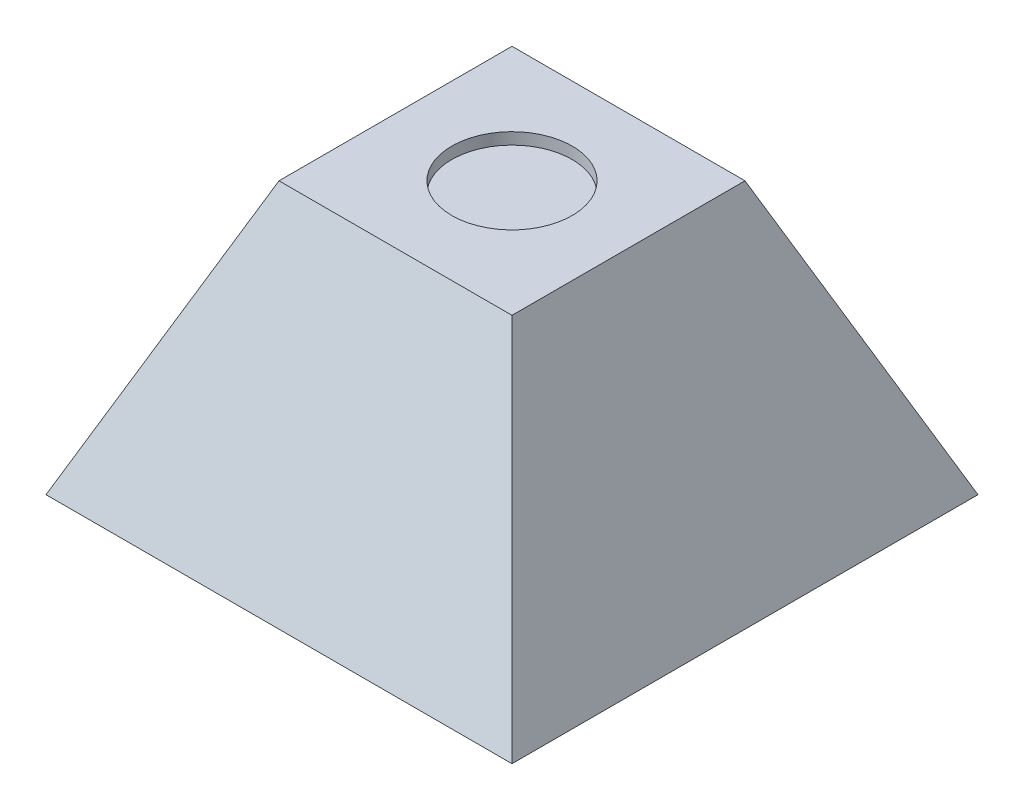
ISO-10303-21;
HEADER;
FILE_DESCRIPTION(('STEP AP214'),'2;1');
FILE_NAME('part.step','',(''),(''),'','','');
FILE_SCHEMA(('AUTOMOTIVE_DESIGN { 1 0 10303 214 1 1 1 1 }'));
ENDSEC;
DATA;
#1=APPLICATION_CONTEXT('core data for automotive mechanical design processes');
#2=APPLICATION_PROTOCOL_DEFINITION('international standard','automotive_design',2000,#1);
#3=PRODUCT_CONTEXT('',#1,'mechanical');
#4=PRODUCT('Part','Part','',(#3));
#5=PRODUCT_RELATED_PRODUCT_CATEGORY('part','',(#4));
#6=PRODUCT_DEFINITION_FORMATION('','',#4);
#7=PRODUCT_DEFINITION_CONTEXT('part definition',#1,'design');
#8=PRODUCT_DEFINITION('design','',#6,#7);
#9=PRODUCT_DEFINITION_SHAPE('','',#8);
#10=(LENGTH_UNIT() NAMED_UNIT(*) SI_UNIT(.MILLI.,.METRE.));
#11=(NAMED_UNIT(*) PLANE_ANGLE_UNIT() SI_UNIT($,.RADIAN.));
#12=(NAMED_UNIT(*) SI_UNIT($,.STERADIAN.) SOLID_ANGLE_UNIT());
#13=UNCERTAINTY_MEASURE_WITH_UNIT(LENGTH_MEASURE(1.E-05),#10,'distance_accuracy_value','');
#14=(GEOMETRIC_REPRESENTATION_CONTEXT(3) GLOBAL_UNCERTAINTY_ASSIGNED_CONTEXT((#13)) GLOBAL_UNIT_ASSIGNED_CONTEXT((#10,
#11,#12)) REPRESENTATION_CONTEXT('',''));
#15=CARTESIAN_POINT('',(0.,0.,0.));
#16=DIRECTION('',(0.,0.,1.));
#17=DIRECTION('',(1.,0.,0.));
#18=AXIS2_PLACEMENT_3D('',#15,#16,#17);
#19=CARTESIAN_POINT('',(0.,0.,0.));
#20=DIRECTION('',(0.,-1.,0.));
#21=DIRECTION('',(0.,0.,-1.));
#22=AXIS2_PLACEMENT_3D('',#19,#20,#21);
#23=PLANE('',#22);
#24=DIRECTION('',(0.,0.,-1.));
#25=VECTOR('',#24,1.);
#26=CARTESIAN_POINT('',(60.,0.,60.));
#27=LINE('',#26,#25);
#28=CARTESIAN_POINT('',(60.,0.,60.));
#29=VERTEX_POINT('',#28);
#30=CARTESIAN_POINT('',(60.,0.,-60.));
#31=VERTEX_POINT('',#30);
#32=EDGE_CURVE('E179',#29,#31,#27,.T.);
#33=ORIENTED_EDGE('',*,*,#32,.F.);
#34=DIRECTION('',(1.,0.,0.));
#35=VECTOR('',#34,1.);
#36=CARTESIAN_POINT('',(-60.,0.,60.));
#37=LINE('',#36,#35);
#38=CARTESIAN_POINT('',(-60.,0.,60.));
#39=VERTEX_POINT('',#38);
#40=EDGE_CURVE('E12',#39,#29,#37,.T.);
#41=ORIENTED_EDGE('',*,*,#40,.F.);
#42=DIRECTION('',(0.,0.,1.));
#43=VECTOR('',#42,1.);
#44=CARTESIAN_POINT('',(-60.,0.,60.));
#45=LINE('',#44,#43);
#46=CARTESIAN_POINT('',(-60.,0.,-60.));
#47=VERTEX_POINT('',#46);
#48=EDGE_CURVE('E65',#47,#39,#45,.T.);
#49=ORIENTED_EDGE('',*,*,#48,.F.);
#50=DIRECTION('',(-1.,0.,0.));
#51=VECTOR('',#50,1.);
#52=CARTESIAN_POINT('',(-60.,0.,-60.));
#53=LINE('',#52,#51);
#54=EDGE_CURVE('E199',#31,#47,#53,.T.);
#55=ORIENTED_EDGE('',*,*,#54,.F.);
#56=EDGE_LOOP('',(#33,#41,#49,#55));
#57=FACE_BOUND('',#56,.T.);
#58=ADVANCED_FACE('F55',(#57),#23,.T.);
#59=CARTESIAN_POINT('',(0.,70.,0.));
#60=DIRECTION('',(0.,-1.,0.));
#61=DIRECTION('',(0.,0.,-1.));
#62=AXIS2_PLACEMENT_3D('',#59,#60,#61);
#63=PLANE('',#62);
#64=CARTESIAN_POINT('',(0.,70.,0.));
#65=DIRECTION('',(0.,1.,0.));
#66=DIRECTION('',(0.,0.,1.));
#67=AXIS2_PLACEMENT_3D('',#64,#65,#66);
#68=CIRCLE('',#67,15.5);
#69=CARTESIAN_POINT('',(0.,70.,15.5));
#70=VERTEX_POINT('',#69);
#71=EDGE_CURVE('E290',#70,#70,#68,.T.);
#72=ORIENTED_EDGE('',*,*,#71,.F.);
#73=EDGE_LOOP('',(#72));
#74=FACE_BOUND('',#73,.T.);
#75=DIRECTION('',(0.,0.,-1.));
#76=VECTOR('',#75,1.);
#77=CARTESIAN_POINT('',(30.,70.,30.));
#78=LINE('',#77,#76);
#79=CARTESIAN_POINT('',(30.,70.,30.));
#80=VERTEX_POINT('',#79);
#81=CARTESIAN_POINT('',(30.,70.,-30.));
#82=VERTEX_POINT('',#81);
#83=EDGE_CURVE('E167',#80,#82,#78,.T.);
#84=ORIENTED_EDGE('',*,*,#83,.T.);
#85=DIRECTION('',(-1.,0.,0.));
#86=VECTOR('',#85,1.);
#87=CARTESIAN_POINT('',(-30.,70.,-30.));
#88=LINE('',#87,#86);
#89=CARTESIAN_POINT('',(-30.,70.,-30.));
#90=VERTEX_POINT('',#89);
#91=EDGE_CURVE('E124',#82,#90,#88,.T.);
#92=ORIENTED_EDGE('',*,*,#91,.T.);
#93=DIRECTION('',(0.,0.,1.));
#94=VECTOR('',#93,1.);
#95=CARTESIAN_POINT('',(-30.,70.,30.));
#96=LINE('',#95,#94);
#97=CARTESIAN_POINT('',(-30.,70.,30.));
#98=VERTEX_POINT('',#97);
#99=EDGE_CURVE('E104',#90,#98,#96,.T.);
#100=ORIENTED_EDGE('',*,*,#99,.T.);
#101=DIRECTION('',(1.,0.,0.));
#102=VECTOR('',#101,1.);
#103=CARTESIAN_POINT('',(-30.,70.,30.));
#104=LINE('',#103,#102);
#105=EDGE_CURVE('E112',#98,#80,#104,.T.);
#106=ORIENTED_EDGE('',*,*,#105,.T.);
#107=EDGE_LOOP('',(#84,#92,#100,#106));
#108=FACE_BOUND('',#107,.T.);
#109=ADVANCED_FACE('F123',(#74,#108),#63,.F.);
#110=CARTESIAN_POINT('',(-50.6896551724138,21.7241379310345,0.));
#111=DIRECTION('',(-0.919145030018058,0.393919298579168,0.));
#112=DIRECTION('',(-0.393919298579168,-0.919145030018058,0.));
#113=AXIS2_PLACEMENT_3D('',#110,#111,#112);
#114=PLANE('',#113);
#115=DIRECTION('',(-0.366508333068916,-0.855186110494137,-0.366508333068916));
#116=VECTOR('',#115,1.);
#117=CARTESIAN_POINT('',(-30.,70.,-30.));
#118=LINE('',#117,#116);
#119=EDGE_CURVE('E110',#90,#47,#118,.T.);
#120=ORIENTED_EDGE('',*,*,#119,.T.);
#121=ORIENTED_EDGE('',*,*,#48,.T.);
#122=DIRECTION('',(-0.366508333068916,-0.855186110494137,0.366508333068916));
#123=VECTOR('',#122,1.);
#124=CARTESIAN_POINT('',(-30.,70.,30.));
#125=LINE('',#124,#123);
#126=EDGE_CURVE('E99',#98,#39,#125,.T.);
#127=ORIENTED_EDGE('',*,*,#126,.F.);
#128=ORIENTED_EDGE('',*,*,#99,.F.);
#129=EDGE_LOOP('',(#120,#121,#127,#128));
#130=FACE_BOUND('',#129,.T.);
#131=ADVANCED_FACE('F102',(#130),#114,.T.);
#132=CARTESIAN_POINT('',(0.,21.7241379310345,50.6896551724138));
#133=DIRECTION('',(0.,0.393919298579168,0.919145030018058));
#134=DIRECTION('',(0.,-0.919145030018058,0.393919298579168));
#135=AXIS2_PLACEMENT_3D('',#132,#133,#134);
#136=PLANE('',#135);
#137=ORIENTED_EDGE('',*,*,#126,.T.);
#138=ORIENTED_EDGE('',*,*,#40,.T.);
#139=DIRECTION('',(0.366508333068916,-0.855186110494137,0.366508333068916));
#140=VECTOR('',#139,1.);
#141=CARTESIAN_POINT('',(30.,70.,30.));
#142=LINE('',#141,#140);
#143=EDGE_CURVE('E73',#80,#29,#142,.T.);
#144=ORIENTED_EDGE('',*,*,#143,.F.);
#145=ORIENTED_EDGE('',*,*,#105,.F.);
#146=EDGE_LOOP('',(#137,#138,#144,#145));
#147=FACE_BOUND('',#146,.T.);
#148=ADVANCED_FACE('F114',(#147),#136,.T.);
#149=CARTESIAN_POINT('',(0.,21.7241379310345,-50.6896551724138));
#150=DIRECTION('',(0.,0.393919298579168,-0.919145030018058));
#151=DIRECTION('',(0.,0.919145030018058,0.393919298579168));
#152=AXIS2_PLACEMENT_3D('',#149,#150,#151);
#153=PLANE('',#152);
#154=DIRECTION('',(0.366508333068916,-0.855186110494137,-0.366508333068916));
#155=VECTOR('',#154,1.);
#156=CARTESIAN_POINT('',(30.,70.,-30.));
#157=LINE('',#156,#155);
#158=EDGE_CURVE('E109',#82,#31,#157,.T.);
#159=ORIENTED_EDGE('',*,*,#158,.T.);
#160=ORIENTED_EDGE('',*,*,#54,.T.);
#161=ORIENTED_EDGE('',*,*,#119,.F.);
#162=ORIENTED_EDGE('',*,*,#91,.F.);
#163=EDGE_LOOP('',(#159,#160,#161,#162));
#164=FACE_BOUND('',#163,.T.);
#165=ADVANCED_FACE('F230',(#164),#153,.T.);
#166=CARTESIAN_POINT('',(50.6896551724138,21.7241379310345,0.));
#167=DIRECTION('',(0.919145030018058,0.393919298579168,0.));
#168=DIRECTION('',(-0.393919298579168,0.919145030018058,0.));
#169=AXIS2_PLACEMENT_3D('',#166,#167,#168);
#170=PLANE('',#169);
#171=ORIENTED_EDGE('',*,*,#143,.T.);
#172=ORIENTED_EDGE('',*,*,#32,.T.);
#173=ORIENTED_EDGE('',*,*,#158,.F.);
#174=ORIENTED_EDGE('',*,*,#83,.F.);
#175=EDGE_LOOP('',(#171,#172,#173,#174));
#176=FACE_BOUND('',#175,.T.);
#177=ADVANCED_FACE('F238',(#176),#170,.T.);
#178=CARTESIAN_POINT('',(0.,67.,0.));
#179=DIRECTION('',(0.,1.,0.));
#180=DIRECTION('',(0.,0.,1.));
#181=AXIS2_PLACEMENT_3D('',#178,#179,#180);
#182=CYLINDRICAL_SURFACE('',#181,15.5);
#183=CARTESIAN_POINT('',(0.,67.,0.));
#184=DIRECTION('',(0.,1.,0.));
#185=DIRECTION('',(0.,0.,1.));
#186=AXIS2_PLACEMENT_3D('',#183,#184,#185);
#187=CIRCLE('',#186,15.5);
#188=CARTESIAN_POINT('',(0.,67.,15.5));
#189=VERTEX_POINT('',#188);
#190=EDGE_CURVE('E288',#189,#189,#187,.T.);
#191=ORIENTED_EDGE('',*,*,#190,.F.);
#192=EDGE_LOOP('',(#191));
#193=FACE_BOUND('',#192,.T.);
#194=ORIENTED_EDGE('',*,*,#71,.T.);
#195=EDGE_LOOP('',(#194));
#196=FACE_BOUND('',#195,.T.);
#197=ADVANCED_FACE('F145',(#193,#196),#182,.F.);
#198=CARTESIAN_POINT('',(0.,67.,0.));
#199=DIRECTION('',(0.,1.,0.));
#200=DIRECTION('',(0.,0.,1.));
#201=AXIS2_PLACEMENT_3D('',#198,#199,#200);
#202=PLANE('',#201);
#203=ORIENTED_EDGE('',*,*,#190,.T.);
#204=EDGE_LOOP('',(#203));
#205=FACE_BOUND('',#204,.T.);
#206=ADVANCED_FACE('F299',(#205),#202,.T.);
#207=CLOSED_SHELL('',(#58,#109,#131,#148,#165,#177,#197,#206));
#208=MANIFOLD_SOLID_BREP('B2',#207);
#209=ADVANCED_BREP_SHAPE_REPRESENTATION('',(#18,#208),#14);
#210=SHAPE_DEFINITION_REPRESENTATION(#9,#209);
ENDSEC;
END-ISO-10303-21;
